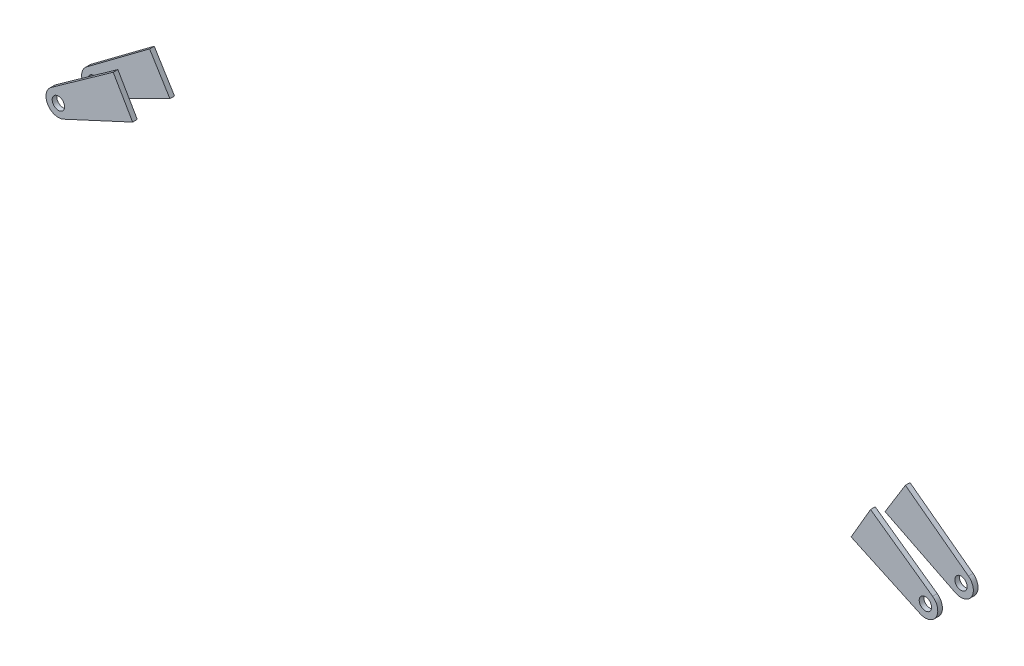
ISO-10303-21;
HEADER;
FILE_DESCRIPTION(('STEP AP214'),'2;1');
FILE_NAME('part.step','',(''),(''),'','','');
FILE_SCHEMA(('AUTOMOTIVE_DESIGN { 1 0 10303 214 1 1 1 1 }'));
ENDSEC;
DATA;
#1=APPLICATION_CONTEXT('core data for automotive mechanical design processes');
#2=APPLICATION_PROTOCOL_DEFINITION('international standard','automotive_design',2000,#1);
#3=PRODUCT_CONTEXT('',#1,'mechanical');
#4=PRODUCT('Part','Part','',(#3));
#5=PRODUCT_RELATED_PRODUCT_CATEGORY('part','',(#4));
#6=PRODUCT_DEFINITION_FORMATION('','',#4);
#7=PRODUCT_DEFINITION_CONTEXT('part definition',#1,'design');
#8=PRODUCT_DEFINITION('design','',#6,#7);
#9=PRODUCT_DEFINITION_SHAPE('','',#8);
#10=(LENGTH_UNIT() NAMED_UNIT(*) SI_UNIT(.MILLI.,.METRE.));
#11=(NAMED_UNIT(*) PLANE_ANGLE_UNIT() SI_UNIT($,.RADIAN.));
#12=(NAMED_UNIT(*) SI_UNIT($,.STERADIAN.) SOLID_ANGLE_UNIT());
#13=UNCERTAINTY_MEASURE_WITH_UNIT(LENGTH_MEASURE(1.E-05),#10,'distance_accuracy_value','');
#14=(GEOMETRIC_REPRESENTATION_CONTEXT(3) GLOBAL_UNCERTAINTY_ASSIGNED_CONTEXT((#13)) GLOBAL_UNIT_ASSIGNED_CONTEXT((#10,
#11,#12)) REPRESENTATION_CONTEXT('',''));
#15=CARTESIAN_POINT('',(0.,0.,0.));
#16=DIRECTION('',(0.,0.,1.));
#17=DIRECTION('',(1.,0.,0.));
#18=AXIS2_PLACEMENT_3D('',#15,#16,#17);
#19=CARTESIAN_POINT('',(1.26342334762563E-11,7.28898085168633E-12,283.999999999937));
#20=DIRECTION('',(0.,0.,-1.));
#21=DIRECTION('',(1.,0.,0.));
#22=AXIS2_PLACEMENT_3D('',#19,#20,#21);
#23=PLANE('',#22);
#24=CARTESIAN_POINT('',(-280.,-1980.,283.999999999998));
#25=DIRECTION('',(0.,0.,-1.));
#26=DIRECTION('',(-1.,0.,0.));
#27=AXIS2_PLACEMENT_3D('',#24,#25,#26);
#28=CIRCLE('',#27,8.00000000000016);
#29=CARTESIAN_POINT('',(-276.426705147636,-1987.15762278261,283.999999999998));
#30=VERTEX_POINT('',#29);
#31=CARTESIAN_POINT('',(-284.788269751895,-1973.5912190876,283.999999999998));
#32=VERTEX_POINT('',#31);
#33=EDGE_CURVE('E147',#30,#32,#28,.T.);
#34=ORIENTED_EDGE('',*,*,#33,.T.);
#35=DIRECTION('',(0.801097614049472,0.598533718986862,0.));
#36=VECTOR('',#35,1.);
#37=CARTESIAN_POINT('',(-284.788269751895,-1973.5912190876,283.999999999998));
#38=LINE('',#37,#36);
#39=CARTESIAN_POINT('',(-244.088028862721,-1943.18235740105,283.999999999996));
#40=VERTEX_POINT('',#39);
#41=EDGE_CURVE('E188',#32,#40,#38,.T.);
#42=ORIENTED_EDGE('',*,*,#41,.T.);
#43=DIRECTION('',(-0.524689367841298,0.851293760857143,0.));
#44=VECTOR('',#43,1.);
#45=CARTESIAN_POINT('',(-230.970794666689,-1964.46470142248,283.999999999996));
#46=LINE('',#45,#44);
#47=CARTESIAN_POINT('',(-230.970794666689,-1964.46470142248,283.999999999996));
#48=VERTEX_POINT('',#47);
#49=EDGE_CURVE('E253',#48,#40,#46,.T.);
#50=ORIENTED_EDGE('',*,*,#49,.F.);
#51=DIRECTION('',(0.894702847825627,0.446661856545545,0.));
#52=VECTOR('',#51,1.);
#53=CARTESIAN_POINT('',(-276.426705147636,-1987.15762278261,283.999999999998));
#54=LINE('',#53,#52);
#55=EDGE_CURVE('E221',#30,#48,#54,.T.);
#56=ORIENTED_EDGE('',*,*,#55,.F.);
#57=EDGE_LOOP('',(#34,#42,#50,#56));
#58=FACE_BOUND('',#57,.T.);
#59=CARTESIAN_POINT('',(-280.,-1980.,283.999999999998));
#60=DIRECTION('',(0.,0.,-1.));
#61=DIRECTION('',(-1.,0.,0.));
#62=AXIS2_PLACEMENT_3D('',#59,#60,#61);
#63=CIRCLE('',#62,3.99999999999999);
#64=CARTESIAN_POINT('',(-284.,-1980.,283.999999999998));
#65=VERTEX_POINT('',#64);
#66=EDGE_CURVE('E219',#65,#65,#63,.T.);
#67=ORIENTED_EDGE('',*,*,#66,.F.);
#68=EDGE_LOOP('',(#67));
#69=FACE_BOUND('',#68,.T.);
#70=ADVANCED_FACE('F138',(#58,#69),#23,.T.);
#71=CARTESIAN_POINT('',(1.26342334762563E-11,7.28898085168633E-12,286.999999999937));
#72=DIRECTION('',(0.,0.,-1.));
#73=DIRECTION('',(1.,0.,0.));
#74=AXIS2_PLACEMENT_3D('',#71,#72,#73);
#75=PLANE('',#74);
#76=CARTESIAN_POINT('',(-280.,-1980.,286.999999999998));
#77=DIRECTION('',(0.,0.,-1.));
#78=DIRECTION('',(-1.,0.,0.));
#79=AXIS2_PLACEMENT_3D('',#76,#77,#78);
#80=CIRCLE('',#79,8.00000000000016);
#81=CARTESIAN_POINT('',(-276.426705147636,-1987.15762278261,286.999999999998));
#82=VERTEX_POINT('',#81);
#83=CARTESIAN_POINT('',(-284.788269751895,-1973.5912190876,286.999999999998));
#84=VERTEX_POINT('',#83);
#85=EDGE_CURVE('E13',#82,#84,#80,.T.);
#86=ORIENTED_EDGE('',*,*,#85,.F.);
#87=DIRECTION('',(0.894702847825627,0.446661856545545,0.));
#88=VECTOR('',#87,1.);
#89=CARTESIAN_POINT('',(-276.426705147636,-1987.15762278261,286.999999999998));
#90=LINE('',#89,#88);
#91=CARTESIAN_POINT('',(-230.970794666689,-1964.46470142248,286.999999999996));
#92=VERTEX_POINT('',#91);
#93=EDGE_CURVE('E229',#82,#92,#90,.T.);
#94=ORIENTED_EDGE('',*,*,#93,.T.);
#95=DIRECTION('',(-0.524689367841298,0.851293760857143,0.));
#96=VECTOR('',#95,1.);
#97=CARTESIAN_POINT('',(-230.970794666689,-1964.46470142248,286.999999999996));
#98=LINE('',#97,#96);
#99=CARTESIAN_POINT('',(-244.088028862721,-1943.18235740105,286.999999999996));
#100=VERTEX_POINT('',#99);
#101=EDGE_CURVE('E196',#92,#100,#98,.T.);
#102=ORIENTED_EDGE('',*,*,#101,.T.);
#103=DIRECTION('',(0.801097614049472,0.598533718986862,0.));
#104=VECTOR('',#103,1.);
#105=CARTESIAN_POINT('',(-284.788269751895,-1973.5912190876,286.999999999998));
#106=LINE('',#105,#104);
#107=EDGE_CURVE('E185',#84,#100,#106,.T.);
#108=ORIENTED_EDGE('',*,*,#107,.F.);
#109=EDGE_LOOP('',(#86,#94,#102,#108));
#110=FACE_BOUND('',#109,.T.);
#111=CARTESIAN_POINT('',(-280.,-1980.,286.999999999998));
#112=DIRECTION('',(0.,0.,-1.));
#113=DIRECTION('',(-1.,0.,0.));
#114=AXIS2_PLACEMENT_3D('',#111,#112,#113);
#115=CIRCLE('',#114,3.99999999999999);
#116=CARTESIAN_POINT('',(-284.,-1980.,286.999999999998));
#117=VERTEX_POINT('',#116);
#118=EDGE_CURVE('E222',#117,#117,#115,.T.);
#119=ORIENTED_EDGE('',*,*,#118,.T.);
#120=EDGE_LOOP('',(#119));
#121=FACE_BOUND('',#120,.T.);
#122=ADVANCED_FACE('F193',(#110,#121),#75,.F.);
#123=CARTESIAN_POINT('',(-276.426705147636,-1987.15762278261,286.999999999998));
#124=DIRECTION('',(0.446661856545545,-0.894702847825627,0.));
#125=DIRECTION('',(-0.894702847825627,-0.446661856545545,0.));
#126=AXIS2_PLACEMENT_3D('',#123,#124,#125);
#127=PLANE('',#126);
#128=ORIENTED_EDGE('',*,*,#55,.T.);
#129=DIRECTION('',(0.,0.,-1.));
#130=VECTOR('',#129,1.);
#131=CARTESIAN_POINT('',(-230.970794666689,-1964.46470142248,286.999999999996));
#132=LINE('',#131,#130);
#133=EDGE_CURVE('E167',#92,#48,#132,.T.);
#134=ORIENTED_EDGE('',*,*,#133,.F.);
#135=ORIENTED_EDGE('',*,*,#93,.F.);
#136=DIRECTION('',(0.,0.,-1.));
#137=VECTOR('',#136,1.);
#138=CARTESIAN_POINT('',(-276.426705147636,-1987.15762278261,286.999999999998));
#139=LINE('',#138,#137);
#140=EDGE_CURVE('E155',#82,#30,#139,.T.);
#141=ORIENTED_EDGE('',*,*,#140,.T.);
#142=EDGE_LOOP('',(#128,#134,#135,#141));
#143=FACE_BOUND('',#142,.T.);
#144=ADVANCED_FACE('F208',(#143),#127,.T.);
#145=CARTESIAN_POINT('',(-230.970794666689,-1964.46470142248,286.999999999996));
#146=DIRECTION('',(0.851293760857143,0.524689367841298,0.));
#147=DIRECTION('',(0.524689367841298,-0.851293760857143,0.));
#148=AXIS2_PLACEMENT_3D('',#145,#146,#147);
#149=PLANE('',#148);
#150=ORIENTED_EDGE('',*,*,#49,.T.);
#151=DIRECTION('',(0.,0.,-1.));
#152=VECTOR('',#151,1.);
#153=CARTESIAN_POINT('',(-244.088028862721,-1943.18235740105,286.999999999996));
#154=LINE('',#153,#152);
#155=EDGE_CURVE('E176',#100,#40,#154,.T.);
#156=ORIENTED_EDGE('',*,*,#155,.F.);
#157=ORIENTED_EDGE('',*,*,#101,.F.);
#158=ORIENTED_EDGE('',*,*,#133,.T.);
#159=EDGE_LOOP('',(#150,#156,#157,#158));
#160=FACE_BOUND('',#159,.T.);
#161=ADVANCED_FACE('F200',(#160),#149,.T.);
#162=CARTESIAN_POINT('',(-280.,-1980.,286.999999999998));
#163=DIRECTION('',(0.,0.,-1.));
#164=DIRECTION('',(1.,0.,0.));
#165=AXIS2_PLACEMENT_3D('',#162,#163,#164);
#166=CYLINDRICAL_SURFACE('',#165,8.00000000000016);
#167=ORIENTED_EDGE('',*,*,#33,.F.);
#168=ORIENTED_EDGE('',*,*,#140,.F.);
#169=ORIENTED_EDGE('',*,*,#85,.T.);
#170=DIRECTION('',(0.,0.,-1.));
#171=VECTOR('',#170,1.);
#172=CARTESIAN_POINT('',(-284.788269751895,-1973.5912190876,286.999999999998));
#173=LINE('',#172,#171);
#174=EDGE_CURVE('E182',#84,#32,#173,.T.);
#175=ORIENTED_EDGE('',*,*,#174,.T.);
#176=EDGE_LOOP('',(#167,#168,#169,#175));
#177=FACE_BOUND('',#176,.T.);
#178=ADVANCED_FACE('F198',(#177),#166,.T.);
#179=CARTESIAN_POINT('',(-284.788269751895,-1973.5912190876,286.999999999998));
#180=DIRECTION('',(0.598533718986862,-0.801097614049472,0.));
#181=DIRECTION('',(-0.801097614049472,-0.598533718986862,0.));
#182=AXIS2_PLACEMENT_3D('',#179,#180,#181);
#183=PLANE('',#182);
#184=ORIENTED_EDGE('',*,*,#41,.F.);
#185=ORIENTED_EDGE('',*,*,#174,.F.);
#186=ORIENTED_EDGE('',*,*,#107,.T.);
#187=ORIENTED_EDGE('',*,*,#155,.T.);
#188=EDGE_LOOP('',(#184,#185,#186,#187));
#189=FACE_BOUND('',#188,.T.);
#190=ADVANCED_FACE('F184',(#189),#183,.F.);
#191=CARTESIAN_POINT('',(-280.,-1980.,286.999999999998));
#192=DIRECTION('',(0.,0.,-1.));
#193=DIRECTION('',(1.,0.,0.));
#194=AXIS2_PLACEMENT_3D('',#191,#192,#193);
#195=CYLINDRICAL_SURFACE('',#194,3.99999999999999);
#196=ORIENTED_EDGE('',*,*,#118,.F.);
#197=EDGE_LOOP('',(#196));
#198=FACE_BOUND('',#197,.T.);
#199=ORIENTED_EDGE('',*,*,#66,.T.);
#200=EDGE_LOOP('',(#199));
#201=FACE_BOUND('',#200,.T.);
#202=ADVANCED_FACE('F206',(#198,#201),#195,.F.);
#203=CLOSED_SHELL('',(#70,#122,#144,#161,#178,#190,#202));
#204=MANIFOLD_SOLID_BREP('B2',#203);
#205=CARTESIAN_POINT('',(7.69813822911801E-12,3.45088955098393E-12,309.999999999968));
#206=DIRECTION('',(0.,0.,-1.));
#207=DIRECTION('',(1.,0.,0.));
#208=AXIS2_PLACEMENT_3D('',#205,#206,#207);
#209=PLANE('',#208);
#210=CARTESIAN_POINT('',(-280.,-1980.,309.999999999998));
#211=DIRECTION('',(0.,0.,-1.));
#212=DIRECTION('',(-1.,0.,0.));
#213=AXIS2_PLACEMENT_3D('',#210,#211,#212);
#214=CIRCLE('',#213,3.99999999999999);
#215=CARTESIAN_POINT('',(-284.,-1980.,309.999999999998));
#216=VERTEX_POINT('',#215);
#217=EDGE_CURVE('E394',#216,#216,#214,.T.);
#218=ORIENTED_EDGE('',*,*,#217,.T.);
#219=EDGE_LOOP('',(#218));
#220=FACE_BOUND('',#219,.T.);
#221=DIRECTION('',(0.90733703155889,0.420403985663673,0.));
#222=VECTOR('',#221,1.);
#223=CARTESIAN_POINT('',(-276.636768114691,-1987.25869625247,309.999999999998));
#224=LINE('',#223,#222);
#225=CARTESIAN_POINT('',(-276.636768114691,-1987.25869625247,309.999999999998));
#226=VERTEX_POINT('',#225);
#227=CARTESIAN_POINT('',(-232.034946593244,-1966.59296468494,309.999999999996));
#228=VERTEX_POINT('',#227);
#229=EDGE_CURVE('E391',#226,#228,#224,.T.);
#230=ORIENTED_EDGE('',*,*,#229,.T.);
#231=DIRECTION('',(-0.502302311756118,0.864692076755916,0.));
#232=VECTOR('',#231,1.);
#233=CARTESIAN_POINT('',(-232.034946593244,-1966.59296468494,309.999999999996));
#234=LINE('',#233,#232);
#235=CARTESIAN_POINT('',(-244.592504387147,-1944.97566276604,309.999999999996));
#236=VERTEX_POINT('',#235);
#237=EDGE_CURVE('E326',#228,#236,#234,.T.);
#238=ORIENTED_EDGE('',*,*,#237,.T.);
#239=DIRECTION('',(-0.814674819575697,-0.579918044510865,0.));
#240=VECTOR('',#239,1.);
#241=CARTESIAN_POINT('',(-244.592504387147,-1944.97566276604,309.999999999996));
#242=LINE('',#241,#240);
#243=CARTESIAN_POINT('',(-284.639344356087,-1973.48260144339,309.999999999998));
#244=VERTEX_POINT('',#243);
#245=EDGE_CURVE('E371',#236,#244,#242,.T.);
#246=ORIENTED_EDGE('',*,*,#245,.T.);
#247=CARTESIAN_POINT('',(-280.,-1980.,309.999999999998));
#248=DIRECTION('',(0.,0.,-1.));
#249=DIRECTION('',(-1.,0.,0.));
#250=AXIS2_PLACEMENT_3D('',#247,#248,#249);
#251=CIRCLE('',#250,7.99999999999964);
#252=EDGE_CURVE('E369',#226,#244,#251,.T.);
#253=ORIENTED_EDGE('',*,*,#252,.F.);
#254=EDGE_LOOP('',(#230,#238,#246,#253));
#255=FACE_BOUND('',#254,.T.);
#256=ADVANCED_FACE('F317',(#220,#255),#209,.F.);
#257=CARTESIAN_POINT('',(7.69813822911801E-12,3.45088955098393E-12,306.999999999968));
#258=DIRECTION('',(0.,0.,-1.));
#259=DIRECTION('',(1.,0.,0.));
#260=AXIS2_PLACEMENT_3D('',#257,#258,#259);
#261=PLANE('',#260);
#262=CARTESIAN_POINT('',(-280.,-1980.,306.999999999998));
#263=DIRECTION('',(0.,0.,-1.));
#264=DIRECTION('',(-1.,0.,0.));
#265=AXIS2_PLACEMENT_3D('',#262,#263,#264);
#266=CIRCLE('',#265,3.99999999999999);
#267=CARTESIAN_POINT('',(-284.,-1980.,306.999999999998));
#268=VERTEX_POINT('',#267);
#269=EDGE_CURVE('E399',#268,#268,#266,.T.);
#270=ORIENTED_EDGE('',*,*,#269,.F.);
#271=EDGE_LOOP('',(#270));
#272=FACE_BOUND('',#271,.T.);
#273=DIRECTION('',(0.90733703155889,0.420403985663673,0.));
#274=VECTOR('',#273,1.);
#275=CARTESIAN_POINT('',(-276.636768114691,-1987.25869625247,306.999999999998));
#276=LINE('',#275,#274);
#277=CARTESIAN_POINT('',(-276.636768114691,-1987.25869625247,306.999999999998));
#278=VERTEX_POINT('',#277);
#279=CARTESIAN_POINT('',(-232.034946593244,-1966.59296468494,306.999999999996));
#280=VERTEX_POINT('',#279);
#281=EDGE_CURVE('E379',#278,#280,#276,.T.);
#282=ORIENTED_EDGE('',*,*,#281,.F.);
#283=CARTESIAN_POINT('',(-280.,-1980.,306.999999999998));
#284=DIRECTION('',(0.,0.,-1.));
#285=DIRECTION('',(-1.,0.,0.));
#286=AXIS2_PLACEMENT_3D('',#283,#284,#285);
#287=CIRCLE('',#286,7.99999999999964);
#288=CARTESIAN_POINT('',(-284.639344356087,-1973.48260144339,306.999999999998));
#289=VERTEX_POINT('',#288);
#290=EDGE_CURVE('E367',#278,#289,#287,.T.);
#291=ORIENTED_EDGE('',*,*,#290,.T.);
#292=DIRECTION('',(-0.814674819575697,-0.579918044510865,0.));
#293=VECTOR('',#292,1.);
#294=CARTESIAN_POINT('',(-244.592504387147,-1944.97566276604,306.999999999996));
#295=LINE('',#294,#293);
#296=CARTESIAN_POINT('',(-244.592504387147,-1944.97566276604,306.999999999996));
#297=VERTEX_POINT('',#296);
#298=EDGE_CURVE('E374',#297,#289,#295,.T.);
#299=ORIENTED_EDGE('',*,*,#298,.F.);
#300=DIRECTION('',(-0.502302311756118,0.864692076755916,0.));
#301=VECTOR('',#300,1.);
#302=CARTESIAN_POINT('',(-232.034946593244,-1966.59296468494,306.999999999996));
#303=LINE('',#302,#301);
#304=EDGE_CURVE('E136',#280,#297,#303,.T.);
#305=ORIENTED_EDGE('',*,*,#304,.F.);
#306=EDGE_LOOP('',(#282,#291,#299,#305));
#307=FACE_BOUND('',#306,.T.);
#308=ADVANCED_FACE('F378',(#272,#307),#261,.T.);
#309=CARTESIAN_POINT('',(-276.636768114691,-1987.25869625247,306.999999999998));
#310=DIRECTION('',(-0.420403985663673,0.90733703155889,0.));
#311=DIRECTION('',(0.90733703155889,0.420403985663673,0.));
#312=AXIS2_PLACEMENT_3D('',#309,#310,#311);
#313=PLANE('',#312);
#314=ORIENTED_EDGE('',*,*,#229,.F.);
#315=DIRECTION('',(0.,0.,1.));
#316=VECTOR('',#315,1.);
#317=CARTESIAN_POINT('',(-276.636768114691,-1987.25869625247,306.999999999998));
#318=LINE('',#317,#316);
#319=EDGE_CURVE('E353',#278,#226,#318,.T.);
#320=ORIENTED_EDGE('',*,*,#319,.F.);
#321=ORIENTED_EDGE('',*,*,#281,.T.);
#322=DIRECTION('',(0.,0.,1.));
#323=VECTOR('',#322,1.);
#324=CARTESIAN_POINT('',(-232.034946593244,-1966.59296468494,306.999999999996));
#325=LINE('',#324,#323);
#326=EDGE_CURVE('E334',#280,#228,#325,.T.);
#327=ORIENTED_EDGE('',*,*,#326,.T.);
#328=EDGE_LOOP('',(#314,#320,#321,#327));
#329=FACE_BOUND('',#328,.T.);
#330=ADVANCED_FACE('F426',(#329),#313,.F.);
#331=CARTESIAN_POINT('',(-244.592504387147,-1944.97566276604,306.999999999996));
#332=DIRECTION('',(0.579918044510865,-0.814674819575697,0.));
#333=DIRECTION('',(-0.814674819575697,-0.579918044510865,0.));
#334=AXIS2_PLACEMENT_3D('',#331,#332,#333);
#335=PLANE('',#334);
#336=ORIENTED_EDGE('',*,*,#245,.F.);
#337=DIRECTION('',(0.,0.,1.));
#338=VECTOR('',#337,1.);
#339=CARTESIAN_POINT('',(-244.592504387147,-1944.97566276604,306.999999999996));
#340=LINE('',#339,#338);
#341=EDGE_CURVE('E364',#297,#236,#340,.T.);
#342=ORIENTED_EDGE('',*,*,#341,.F.);
#343=ORIENTED_EDGE('',*,*,#298,.T.);
#344=DIRECTION('',(0.,0.,1.));
#345=VECTOR('',#344,1.);
#346=CARTESIAN_POINT('',(-284.639344356087,-1973.48260144339,306.999999999998));
#347=LINE('',#346,#345);
#348=EDGE_CURVE('E361',#289,#244,#347,.T.);
#349=ORIENTED_EDGE('',*,*,#348,.T.);
#350=EDGE_LOOP('',(#336,#342,#343,#349));
#351=FACE_BOUND('',#350,.T.);
#352=ADVANCED_FACE('F375',(#351),#335,.F.);
#353=CARTESIAN_POINT('',(-232.034946593244,-1966.59296468494,306.999999999996));
#354=DIRECTION('',(-0.864692076755917,-0.502302311756118,0.));
#355=DIRECTION('',(-0.502302311756118,0.864692076755917,0.));
#356=AXIS2_PLACEMENT_3D('',#353,#354,#355);
#357=PLANE('',#356);
#358=ORIENTED_EDGE('',*,*,#237,.F.);
#359=ORIENTED_EDGE('',*,*,#326,.F.);
#360=ORIENTED_EDGE('',*,*,#304,.T.);
#361=ORIENTED_EDGE('',*,*,#341,.T.);
#362=EDGE_LOOP('',(#358,#359,#360,#361));
#363=FACE_BOUND('',#362,.T.);
#364=ADVANCED_FACE('F434',(#363),#357,.F.);
#365=CARTESIAN_POINT('',(-280.,-1980.,306.999999999998));
#366=DIRECTION('',(0.,0.,1.));
#367=DIRECTION('',(-1.,0.,0.));
#368=AXIS2_PLACEMENT_3D('',#365,#366,#367);
#369=CYLINDRICAL_SURFACE('',#368,7.99999999999964);
#370=ORIENTED_EDGE('',*,*,#252,.T.);
#371=ORIENTED_EDGE('',*,*,#348,.F.);
#372=ORIENTED_EDGE('',*,*,#290,.F.);
#373=ORIENTED_EDGE('',*,*,#319,.T.);
#374=EDGE_LOOP('',(#370,#371,#372,#373));
#375=FACE_BOUND('',#374,.T.);
#376=ADVANCED_FACE('F365',(#375),#369,.T.);
#377=CARTESIAN_POINT('',(-280.,-1980.,306.999999999998));
#378=DIRECTION('',(0.,0.,1.));
#379=DIRECTION('',(-1.,0.,0.));
#380=AXIS2_PLACEMENT_3D('',#377,#378,#379);
#381=CYLINDRICAL_SURFACE('',#380,3.99999999999999);
#382=ORIENTED_EDGE('',*,*,#269,.T.);
#383=EDGE_LOOP('',(#382));
#384=FACE_BOUND('',#383,.T.);
#385=ORIENTED_EDGE('',*,*,#217,.F.);
#386=EDGE_LOOP('',(#385));
#387=FACE_BOUND('',#386,.T.);
#388=ADVANCED_FACE('F422',(#384,#387),#381,.F.);
#389=CLOSED_SHELL('',(#256,#308,#330,#352,#364,#376,#388));
#390=MANIFOLD_SOLID_BREP('B7',#389);
#391=CARTESIAN_POINT('',(-1.26342334762563E-11,7.28898085168633E-12,283.999999999937));
#392=DIRECTION('',(0.,0.,-1.));
#393=DIRECTION('',(-1.,0.,0.));
#394=AXIS2_PLACEMENT_3D('',#391,#392,#393);
#395=PLANE('',#394);
#396=CARTESIAN_POINT('',(280.,-1980.,283.999999999998));
#397=DIRECTION('',(0.,0.,1.));
#398=DIRECTION('',(1.,0.,0.));
#399=AXIS2_PLACEMENT_3D('',#396,#397,#398);
#400=CIRCLE('',#399,8.00000000000016);
#401=CARTESIAN_POINT('',(276.426705147636,-1987.15762278261,283.999999999998));
#402=VERTEX_POINT('',#401);
#403=CARTESIAN_POINT('',(284.788269751895,-1973.5912190876,283.999999999998));
#404=VERTEX_POINT('',#403);
#405=EDGE_CURVE('E504',#402,#404,#400,.T.);
#406=ORIENTED_EDGE('',*,*,#405,.F.);
#407=DIRECTION('',(-0.894702847825627,0.446661856545545,0.));
#408=VECTOR('',#407,1.);
#409=CARTESIAN_POINT('',(276.426705147636,-1987.15762278261,283.999999999998));
#410=LINE('',#409,#408);
#411=CARTESIAN_POINT('',(230.970794666689,-1964.46470142248,283.999999999996));
#412=VERTEX_POINT('',#411);
#413=EDGE_CURVE('E524',#402,#412,#410,.T.);
#414=ORIENTED_EDGE('',*,*,#413,.T.);
#415=DIRECTION('',(0.524689367841298,0.851293760857143,0.));
#416=VECTOR('',#415,1.);
#417=CARTESIAN_POINT('',(230.970794666689,-1964.46470142248,283.999999999996));
#418=LINE('',#417,#416);
#419=CARTESIAN_POINT('',(244.088028862721,-1943.18235740105,283.999999999996));
#420=VERTEX_POINT('',#419);
#421=EDGE_CURVE('E530',#412,#420,#418,.T.);
#422=ORIENTED_EDGE('',*,*,#421,.T.);
#423=DIRECTION('',(-0.801097614049472,0.598533718986862,0.));
#424=VECTOR('',#423,1.);
#425=CARTESIAN_POINT('',(284.788269751895,-1973.5912190876,283.999999999998));
#426=LINE('',#425,#424);
#427=EDGE_CURVE('E555',#404,#420,#426,.T.);
#428=ORIENTED_EDGE('',*,*,#427,.F.);
#429=EDGE_LOOP('',(#406,#414,#422,#428));
#430=FACE_BOUND('',#429,.T.);
#431=CARTESIAN_POINT('',(280.,-1980.,283.999999999998));
#432=DIRECTION('',(0.,0.,1.));
#433=DIRECTION('',(1.,0.,0.));
#434=AXIS2_PLACEMENT_3D('',#431,#432,#433);
#435=CIRCLE('',#434,3.99999999999999);
#436=CARTESIAN_POINT('',(284.,-1980.,283.999999999998));
#437=VERTEX_POINT('',#436);
#438=EDGE_CURVE('E568',#437,#437,#435,.T.);
#439=ORIENTED_EDGE('',*,*,#438,.T.);
#440=EDGE_LOOP('',(#439));
#441=FACE_BOUND('',#440,.T.);
#442=ADVANCED_FACE('F495',(#430,#441),#395,.T.);
#443=CARTESIAN_POINT('',(-1.26342334762563E-11,7.28898085168633E-12,286.999999999937));
#444=DIRECTION('',(0.,0.,-1.));
#445=DIRECTION('',(-1.,0.,0.));
#446=AXIS2_PLACEMENT_3D('',#443,#444,#445);
#447=PLANE('',#446);
#448=CARTESIAN_POINT('',(280.,-1980.,286.999999999998));
#449=DIRECTION('',(0.,0.,1.));
#450=DIRECTION('',(1.,0.,0.));
#451=AXIS2_PLACEMENT_3D('',#448,#449,#450);
#452=CIRCLE('',#451,8.00000000000016);
#453=CARTESIAN_POINT('',(276.426705147636,-1987.15762278261,286.999999999998));
#454=VERTEX_POINT('',#453);
#455=CARTESIAN_POINT('',(284.788269751895,-1973.5912190876,286.999999999998));
#456=VERTEX_POINT('',#455);
#457=EDGE_CURVE('E315',#454,#456,#452,.T.);
#458=ORIENTED_EDGE('',*,*,#457,.T.);
#459=DIRECTION('',(-0.801097614049472,0.598533718986862,0.));
#460=VECTOR('',#459,1.);
#461=CARTESIAN_POINT('',(284.788269751895,-1973.5912190876,286.999999999998));
#462=LINE('',#461,#460);
#463=CARTESIAN_POINT('',(244.088028862721,-1943.18235740105,286.999999999996));
#464=VERTEX_POINT('',#463);
#465=EDGE_CURVE('E540',#456,#464,#462,.T.);
#466=ORIENTED_EDGE('',*,*,#465,.T.);
#467=DIRECTION('',(0.524689367841298,0.851293760857143,0.));
#468=VECTOR('',#467,1.);
#469=CARTESIAN_POINT('',(230.970794666689,-1964.46470142248,286.999999999996));
#470=LINE('',#469,#468);
#471=CARTESIAN_POINT('',(230.970794666689,-1964.46470142248,286.999999999996));
#472=VERTEX_POINT('',#471);
#473=EDGE_CURVE('E574',#472,#464,#470,.T.);
#474=ORIENTED_EDGE('',*,*,#473,.F.);
#475=DIRECTION('',(-0.894702847825627,0.446661856545545,0.));
#476=VECTOR('',#475,1.);
#477=CARTESIAN_POINT('',(276.426705147636,-1987.15762278261,286.999999999998));
#478=LINE('',#477,#476);
#479=EDGE_CURVE('E512',#454,#472,#478,.T.);
#480=ORIENTED_EDGE('',*,*,#479,.F.);
#481=EDGE_LOOP('',(#458,#466,#474,#480));
#482=FACE_BOUND('',#481,.T.);
#483=CARTESIAN_POINT('',(280.,-1980.,286.999999999998));
#484=DIRECTION('',(0.,0.,1.));
#485=DIRECTION('',(1.,0.,0.));
#486=AXIS2_PLACEMENT_3D('',#483,#484,#485);
#487=CIRCLE('',#486,3.99999999999999);
#488=CARTESIAN_POINT('',(284.,-1980.,286.999999999998));
#489=VERTEX_POINT('',#488);
#490=EDGE_CURVE('E596',#489,#489,#487,.T.);
#491=ORIENTED_EDGE('',*,*,#490,.F.);
#492=EDGE_LOOP('',(#491));
#493=FACE_BOUND('',#492,.T.);
#494=ADVANCED_FACE('F538',(#482,#493),#447,.F.);
#495=CARTESIAN_POINT('',(276.426705147636,-1987.15762278261,286.999999999998));
#496=DIRECTION('',(-0.446661856545545,-0.894702847825627,0.));
#497=DIRECTION('',(0.894702847825627,-0.446661856545545,0.));
#498=AXIS2_PLACEMENT_3D('',#495,#496,#497);
#499=PLANE('',#498);
#500=ORIENTED_EDGE('',*,*,#413,.F.);
#501=DIRECTION('',(0.,0.,-1.));
#502=VECTOR('',#501,1.);
#503=CARTESIAN_POINT('',(276.426705147636,-1987.15762278261,286.999999999998));
#504=LINE('',#503,#502);
#505=EDGE_CURVE('E567',#454,#402,#504,.T.);
#506=ORIENTED_EDGE('',*,*,#505,.F.);
#507=ORIENTED_EDGE('',*,*,#479,.T.);
#508=DIRECTION('',(0.,0.,-1.));
#509=VECTOR('',#508,1.);
#510=CARTESIAN_POINT('',(230.970794666689,-1964.46470142248,286.999999999996));
#511=LINE('',#510,#509);
#512=EDGE_CURVE('E581',#472,#412,#511,.T.);
#513=ORIENTED_EDGE('',*,*,#512,.T.);
#514=EDGE_LOOP('',(#500,#506,#507,#513));
#515=FACE_BOUND('',#514,.T.);
#516=ADVANCED_FACE('F603',(#515),#499,.T.);
#517=CARTESIAN_POINT('',(230.970794666689,-1964.46470142248,286.999999999996));
#518=DIRECTION('',(-0.851293760857143,0.524689367841298,0.));
#519=DIRECTION('',(-0.524689367841298,-0.851293760857143,0.));
#520=AXIS2_PLACEMENT_3D('',#517,#518,#519);
#521=PLANE('',#520);
#522=ORIENTED_EDGE('',*,*,#421,.F.);
#523=ORIENTED_EDGE('',*,*,#512,.F.);
#524=ORIENTED_EDGE('',*,*,#473,.T.);
#525=DIRECTION('',(0.,0.,-1.));
#526=VECTOR('',#525,1.);
#527=CARTESIAN_POINT('',(244.088028862721,-1943.18235740105,286.999999999996));
#528=LINE('',#527,#526);
#529=EDGE_CURVE('E551',#464,#420,#528,.T.);
#530=ORIENTED_EDGE('',*,*,#529,.T.);
#531=EDGE_LOOP('',(#522,#523,#524,#530));
#532=FACE_BOUND('',#531,.T.);
#533=ADVANCED_FACE('F608',(#532),#521,.T.);
#534=CARTESIAN_POINT('',(280.,-1980.,286.999999999998));
#535=DIRECTION('',(0.,0.,-1.));
#536=DIRECTION('',(-1.,0.,0.));
#537=AXIS2_PLACEMENT_3D('',#534,#535,#536);
#538=CYLINDRICAL_SURFACE('',#537,8.00000000000016);
#539=ORIENTED_EDGE('',*,*,#405,.T.);
#540=DIRECTION('',(0.,0.,-1.));
#541=VECTOR('',#540,1.);
#542=CARTESIAN_POINT('',(284.788269751895,-1973.5912190876,286.999999999998));
#543=LINE('',#542,#541);
#544=EDGE_CURVE('E549',#456,#404,#543,.T.);
#545=ORIENTED_EDGE('',*,*,#544,.F.);
#546=ORIENTED_EDGE('',*,*,#457,.F.);
#547=ORIENTED_EDGE('',*,*,#505,.T.);
#548=EDGE_LOOP('',(#539,#545,#546,#547));
#549=FACE_BOUND('',#548,.T.);
#550=ADVANCED_FACE('F554',(#549),#538,.T.);
#551=CARTESIAN_POINT('',(284.788269751895,-1973.5912190876,286.999999999998));
#552=DIRECTION('',(-0.598533718986862,-0.801097614049472,0.));
#553=DIRECTION('',(0.801097614049472,-0.598533718986862,0.));
#554=AXIS2_PLACEMENT_3D('',#551,#552,#553);
#555=PLANE('',#554);
#556=ORIENTED_EDGE('',*,*,#427,.T.);
#557=ORIENTED_EDGE('',*,*,#529,.F.);
#558=ORIENTED_EDGE('',*,*,#465,.F.);
#559=ORIENTED_EDGE('',*,*,#544,.T.);
#560=EDGE_LOOP('',(#556,#557,#558,#559));
#561=FACE_BOUND('',#560,.T.);
#562=ADVANCED_FACE('F548',(#561),#555,.F.);
#563=CARTESIAN_POINT('',(280.,-1980.,286.999999999998));
#564=DIRECTION('',(0.,0.,-1.));
#565=DIRECTION('',(-1.,0.,0.));
#566=AXIS2_PLACEMENT_3D('',#563,#564,#565);
#567=CYLINDRICAL_SURFACE('',#566,3.99999999999999);
#568=ORIENTED_EDGE('',*,*,#490,.T.);
#569=EDGE_LOOP('',(#568));
#570=FACE_BOUND('',#569,.T.);
#571=ORIENTED_EDGE('',*,*,#438,.F.);
#572=EDGE_LOOP('',(#571));
#573=FACE_BOUND('',#572,.T.);
#574=ADVANCED_FACE('F600',(#570,#573),#567,.F.);
#575=CLOSED_SHELL('',(#442,#494,#516,#533,#550,#562,#574));
#576=MANIFOLD_SOLID_BREP('B130',#575);
#577=CARTESIAN_POINT('',(-7.69813822911801E-12,3.45088955098393E-12,309.999999999968));
#578=DIRECTION('',(0.,0.,-1.));
#579=DIRECTION('',(-1.,0.,0.));
#580=AXIS2_PLACEMENT_3D('',#577,#578,#579);
#581=PLANE('',#580);
#582=CARTESIAN_POINT('',(280.,-1980.,309.999999999998));
#583=DIRECTION('',(0.,0.,1.));
#584=DIRECTION('',(1.,0.,0.));
#585=AXIS2_PLACEMENT_3D('',#582,#583,#584);
#586=CIRCLE('',#585,3.99999999999999);
#587=CARTESIAN_POINT('',(284.,-1980.,309.999999999998));
#588=VERTEX_POINT('',#587);
#589=EDGE_CURVE('E737',#588,#588,#586,.T.);
#590=ORIENTED_EDGE('',*,*,#589,.F.);
#591=EDGE_LOOP('',(#590));
#592=FACE_BOUND('',#591,.T.);
#593=DIRECTION('',(-0.90733703155889,0.420403985663673,0.));
#594=VECTOR('',#593,1.);
#595=CARTESIAN_POINT('',(276.636768114691,-1987.25869625247,309.999999999998));
#596=LINE('',#595,#594);
#597=CARTESIAN_POINT('',(276.636768114691,-1987.25869625247,309.999999999998));
#598=VERTEX_POINT('',#597);
#599=CARTESIAN_POINT('',(232.034946593244,-1966.59296468494,309.999999999996));
#600=VERTEX_POINT('',#599);
#601=EDGE_CURVE('E694',#598,#600,#596,.T.);
#602=ORIENTED_EDGE('',*,*,#601,.F.);
#603=CARTESIAN_POINT('',(280.,-1980.,309.999999999998));
#604=DIRECTION('',(0.,0.,1.));
#605=DIRECTION('',(1.,0.,0.));
#606=AXIS2_PLACEMENT_3D('',#603,#604,#605);
#607=CIRCLE('',#606,7.99999999999964);
#608=CARTESIAN_POINT('',(284.639344356087,-1973.48260144339,309.999999999998));
#609=VERTEX_POINT('',#608);
#610=EDGE_CURVE('E702',#598,#609,#607,.T.);
#611=ORIENTED_EDGE('',*,*,#610,.T.);
#612=DIRECTION('',(0.814674819575697,-0.579918044510865,0.));
#613=VECTOR('',#612,1.);
#614=CARTESIAN_POINT('',(244.592504387147,-1944.97566276604,309.999999999996));
#615=LINE('',#614,#613);
#616=CARTESIAN_POINT('',(244.592504387147,-1944.97566276604,309.999999999996));
#617=VERTEX_POINT('',#616);
#618=EDGE_CURVE('E709',#617,#609,#615,.T.);
#619=ORIENTED_EDGE('',*,*,#618,.F.);
#620=DIRECTION('',(0.502302311756118,0.864692076755916,0.));
#621=VECTOR('',#620,1.);
#622=CARTESIAN_POINT('',(232.034946593244,-1966.59296468494,309.999999999996));
#623=LINE('',#622,#621);
#624=EDGE_CURVE('E673',#600,#617,#623,.T.);
#625=ORIENTED_EDGE('',*,*,#624,.F.);
#626=EDGE_LOOP('',(#602,#611,#619,#625));
#627=FACE_BOUND('',#626,.T.);
#628=ADVANCED_FACE('F664',(#592,#627),#581,.F.);
#629=CARTESIAN_POINT('',(-7.69813822911801E-12,3.45088955098393E-12,306.999999999968));
#630=DIRECTION('',(0.,0.,-1.));
#631=DIRECTION('',(-1.,0.,0.));
#632=AXIS2_PLACEMENT_3D('',#629,#630,#631);
#633=PLANE('',#632);
#634=CARTESIAN_POINT('',(280.,-1980.,306.999999999998));
#635=DIRECTION('',(0.,0.,1.));
#636=DIRECTION('',(1.,0.,0.));
#637=AXIS2_PLACEMENT_3D('',#634,#635,#636);
#638=CIRCLE('',#637,3.99999999999999);
#639=CARTESIAN_POINT('',(284.,-1980.,306.999999999998));
#640=VERTEX_POINT('',#639);
#641=EDGE_CURVE('E764',#640,#640,#638,.T.);
#642=ORIENTED_EDGE('',*,*,#641,.T.);
#643=EDGE_LOOP('',(#642));
#644=FACE_BOUND('',#643,.T.);
#645=DIRECTION('',(-0.90733703155889,0.420403985663673,0.));
#646=VECTOR('',#645,1.);
#647=CARTESIAN_POINT('',(276.636768114691,-1987.25869625247,306.999999999998));
#648=LINE('',#647,#646);
#649=CARTESIAN_POINT('',(276.636768114691,-1987.25869625247,306.999999999998));
#650=VERTEX_POINT('',#649);
#651=CARTESIAN_POINT('',(232.034946593244,-1966.59296468494,306.999999999996));
#652=VERTEX_POINT('',#651);
#653=EDGE_CURVE('E752',#650,#652,#648,.T.);
#654=ORIENTED_EDGE('',*,*,#653,.T.);
#655=DIRECTION('',(0.502302311756118,0.864692076755916,0.));
#656=VECTOR('',#655,1.);
#657=CARTESIAN_POINT('',(232.034946593244,-1966.59296468494,306.999999999996));
#658=LINE('',#657,#656);
#659=CARTESIAN_POINT('',(244.592504387147,-1944.97566276604,306.999999999996));
#660=VERTEX_POINT('',#659);
#661=EDGE_CURVE('E493',#652,#660,#658,.T.);
#662=ORIENTED_EDGE('',*,*,#661,.T.);
#663=DIRECTION('',(0.814674819575697,-0.579918044510865,0.));
#664=VECTOR('',#663,1.);
#665=CARTESIAN_POINT('',(244.592504387147,-1944.97566276604,306.999999999996));
#666=LINE('',#665,#664);
#667=CARTESIAN_POINT('',(284.639344356087,-1973.48260144339,306.999999999998));
#668=VERTEX_POINT('',#667);
#669=EDGE_CURVE('E724',#660,#668,#666,.T.);
#670=ORIENTED_EDGE('',*,*,#669,.T.);
#671=CARTESIAN_POINT('',(280.,-1980.,306.999999999998));
#672=DIRECTION('',(0.,0.,1.));
#673=DIRECTION('',(1.,0.,0.));
#674=AXIS2_PLACEMENT_3D('',#671,#672,#673);
#675=CIRCLE('',#674,7.99999999999964);
#676=EDGE_CURVE('E715',#650,#668,#675,.T.);
#677=ORIENTED_EDGE('',*,*,#676,.F.);
#678=EDGE_LOOP('',(#654,#662,#670,#677));
#679=FACE_BOUND('',#678,.T.);
#680=ADVANCED_FACE('F726',(#644,#679),#633,.T.);
#681=CARTESIAN_POINT('',(276.636768114691,-1987.25869625247,306.999999999998));
#682=DIRECTION('',(0.420403985663673,0.90733703155889,0.));
#683=DIRECTION('',(-0.90733703155889,0.420403985663673,0.));
#684=AXIS2_PLACEMENT_3D('',#681,#682,#683);
#685=PLANE('',#684);
#686=ORIENTED_EDGE('',*,*,#601,.T.);
#687=DIRECTION('',(0.,0.,1.));
#688=VECTOR('',#687,1.);
#689=CARTESIAN_POINT('',(232.034946593244,-1966.59296468494,306.999999999996));
#690=LINE('',#689,#688);
#691=EDGE_CURVE('E750',#652,#600,#690,.T.);
#692=ORIENTED_EDGE('',*,*,#691,.F.);
#693=ORIENTED_EDGE('',*,*,#653,.F.);
#694=DIRECTION('',(0.,0.,1.));
#695=VECTOR('',#694,1.);
#696=CARTESIAN_POINT('',(276.636768114691,-1987.25869625247,306.999999999998));
#697=LINE('',#696,#695);
#698=EDGE_CURVE('E718',#650,#598,#697,.T.);
#699=ORIENTED_EDGE('',*,*,#698,.T.);
#700=EDGE_LOOP('',(#686,#692,#693,#699));
#701=FACE_BOUND('',#700,.T.);
#702=ADVANCED_FACE('F780',(#701),#685,.F.);
#703=CARTESIAN_POINT('',(244.592504387147,-1944.97566276604,306.999999999996));
#704=DIRECTION('',(-0.579918044510865,-0.814674819575697,0.));
#705=DIRECTION('',(0.814674819575697,-0.579918044510865,0.));
#706=AXIS2_PLACEMENT_3D('',#703,#704,#705);
#707=PLANE('',#706);
#708=ORIENTED_EDGE('',*,*,#618,.T.);
#709=DIRECTION('',(0.,0.,1.));
#710=VECTOR('',#709,1.);
#711=CARTESIAN_POINT('',(284.639344356087,-1973.48260144339,306.999999999998));
#712=LINE('',#711,#710);
#713=EDGE_CURVE('E717',#668,#609,#712,.T.);
#714=ORIENTED_EDGE('',*,*,#713,.F.);
#715=ORIENTED_EDGE('',*,*,#669,.F.);
#716=DIRECTION('',(0.,0.,1.));
#717=VECTOR('',#716,1.);
#718=CARTESIAN_POINT('',(244.592504387147,-1944.97566276604,306.999999999996));
#719=LINE('',#718,#717);
#720=EDGE_CURVE('E727',#660,#617,#719,.T.);
#721=ORIENTED_EDGE('',*,*,#720,.T.);
#722=EDGE_LOOP('',(#708,#714,#715,#721));
#723=FACE_BOUND('',#722,.T.);
#724=ADVANCED_FACE('F723',(#723),#707,.F.);
#725=CARTESIAN_POINT('',(232.034946593244,-1966.59296468494,306.999999999996));
#726=DIRECTION('',(0.864692076755917,-0.502302311756118,0.));
#727=DIRECTION('',(0.502302311756118,0.864692076755917,0.));
#728=AXIS2_PLACEMENT_3D('',#725,#726,#727);
#729=PLANE('',#728);
#730=ORIENTED_EDGE('',*,*,#624,.T.);
#731=ORIENTED_EDGE('',*,*,#720,.F.);
#732=ORIENTED_EDGE('',*,*,#661,.F.);
#733=ORIENTED_EDGE('',*,*,#691,.T.);
#734=EDGE_LOOP('',(#730,#731,#732,#733));
#735=FACE_BOUND('',#734,.T.);
#736=ADVANCED_FACE('F782',(#735),#729,.F.);
#737=CARTESIAN_POINT('',(280.,-1980.,306.999999999998));
#738=DIRECTION('',(0.,0.,1.));
#739=DIRECTION('',(1.,0.,0.));
#740=AXIS2_PLACEMENT_3D('',#737,#738,#739);
#741=CYLINDRICAL_SURFACE('',#740,7.99999999999964);
#742=ORIENTED_EDGE('',*,*,#610,.F.);
#743=ORIENTED_EDGE('',*,*,#698,.F.);
#744=ORIENTED_EDGE('',*,*,#676,.T.);
#745=ORIENTED_EDGE('',*,*,#713,.T.);
#746=EDGE_LOOP('',(#742,#743,#744,#745));
#747=FACE_BOUND('',#746,.T.);
#748=ADVANCED_FACE('F716',(#747),#741,.T.);
#749=CARTESIAN_POINT('',(280.,-1980.,306.999999999998));
#750=DIRECTION('',(0.,0.,1.));
#751=DIRECTION('',(1.,0.,0.));
#752=AXIS2_PLACEMENT_3D('',#749,#750,#751);
#753=CYLINDRICAL_SURFACE('',#752,3.99999999999999);
#754=ORIENTED_EDGE('',*,*,#641,.F.);
#755=EDGE_LOOP('',(#754));
#756=FACE_BOUND('',#755,.T.);
#757=ORIENTED_EDGE('',*,*,#589,.T.);
#758=EDGE_LOOP('',(#757));
#759=FACE_BOUND('',#758,.T.);
#760=ADVANCED_FACE('F769',(#756,#759),#753,.F.);
#761=CLOSED_SHELL('',(#628,#680,#702,#724,#736,#748,#760));
#762=MANIFOLD_SOLID_BREP('B309',#761);
#763=ADVANCED_BREP_SHAPE_REPRESENTATION('',(#18,#204,#390,#576,#762),#14);
#764=SHAPE_DEFINITION_REPRESENTATION(#9,#763);
ENDSEC;
END-ISO-10303-21;
